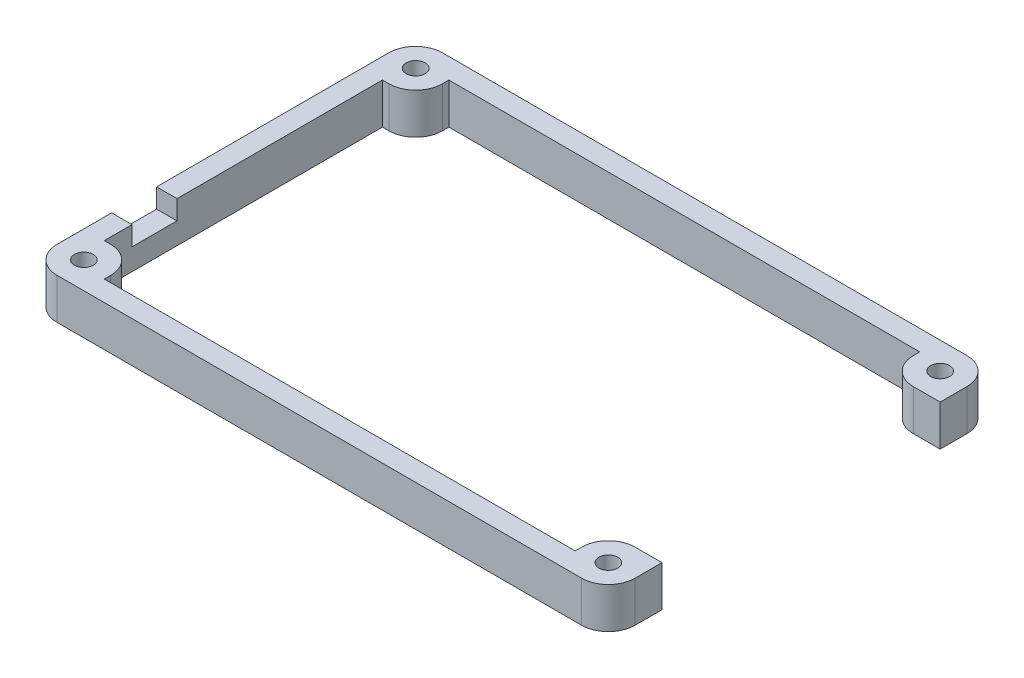
ISO-10303-21;
HEADER;
FILE_DESCRIPTION(('STEP AP214'),'2;1');
FILE_NAME('part.step','',(''),(''),'','','');
FILE_SCHEMA(('AUTOMOTIVE_DESIGN { 1 0 10303 214 1 1 1 1 }'));
ENDSEC;
DATA;
#1=APPLICATION_CONTEXT('core data for automotive mechanical design processes');
#2=APPLICATION_PROTOCOL_DEFINITION('international standard','automotive_design',2000,#1);
#3=PRODUCT_CONTEXT('',#1,'mechanical');
#4=PRODUCT('Part','Part','',(#3));
#5=PRODUCT_RELATED_PRODUCT_CATEGORY('part','',(#4));
#6=PRODUCT_DEFINITION_FORMATION('','',#4);
#7=PRODUCT_DEFINITION_CONTEXT('part definition',#1,'design');
#8=PRODUCT_DEFINITION('design','',#6,#7);
#9=PRODUCT_DEFINITION_SHAPE('','',#8);
#10=(LENGTH_UNIT() NAMED_UNIT(*) SI_UNIT(.MILLI.,.METRE.));
#11=(NAMED_UNIT(*) PLANE_ANGLE_UNIT() SI_UNIT($,.RADIAN.));
#12=(NAMED_UNIT(*) SI_UNIT($,.STERADIAN.) SOLID_ANGLE_UNIT());
#13=UNCERTAINTY_MEASURE_WITH_UNIT(LENGTH_MEASURE(1.E-05),#10,'distance_accuracy_value','');
#14=(GEOMETRIC_REPRESENTATION_CONTEXT(3) GLOBAL_UNCERTAINTY_ASSIGNED_CONTEXT((#13)) GLOBAL_UNIT_ASSIGNED_CONTEXT((#10,
#11,#12)) REPRESENTATION_CONTEXT('',''));
#15=CARTESIAN_POINT('',(0.,0.,0.));
#16=DIRECTION('',(0.,0.,1.));
#17=DIRECTION('',(1.,0.,0.));
#18=AXIS2_PLACEMENT_3D('',#15,#16,#17);
#19=CARTESIAN_POINT('',(-40.825,6.35,-25.825));
#20=DIRECTION('',(0.,1.,0.));
#21=DIRECTION('',(0.,0.,1.));
#22=AXIS2_PLACEMENT_3D('',#19,#20,#21);
#23=PLANE('',#22);
#24=DIRECTION('',(-1.,0.,0.));
#25=VECTOR('',#24,1.);
#26=CARTESIAN_POINT('',(40.825,6.35,-21.65));
#27=LINE('',#26,#25);
#28=CARTESIAN_POINT('',(45.,6.35,-21.65));
#29=VERTEX_POINT('',#28);
#30=CARTESIAN_POINT('',(40.825,6.35,-21.65));
#31=VERTEX_POINT('',#30);
#32=EDGE_CURVE('E375',#29,#31,#27,.T.);
#33=ORIENTED_EDGE('',*,*,#32,.F.);
#34=DIRECTION('',(0.,0.,-1.));
#35=VECTOR('',#34,1.);
#36=CARTESIAN_POINT('',(45.,6.35,-25.825));
#37=LINE('',#36,#35);
#38=CARTESIAN_POINT('',(45.,6.35,-25.825));
#39=VERTEX_POINT('',#38);
#40=EDGE_CURVE('E324',#29,#39,#37,.T.);
#41=ORIENTED_EDGE('',*,*,#40,.T.);
#42=CARTESIAN_POINT('',(40.825,6.35,-25.825));
#43=DIRECTION('',(0.,1.,0.));
#44=DIRECTION('',(0.,0.,1.));
#45=AXIS2_PLACEMENT_3D('',#42,#43,#44);
#46=CIRCLE('',#45,4.175);
#47=CARTESIAN_POINT('',(40.825,6.35,-30.));
#48=VERTEX_POINT('',#47);
#49=EDGE_CURVE('E330',#39,#48,#46,.T.);
#50=ORIENTED_EDGE('',*,*,#49,.T.);
#51=DIRECTION('',(-1.,0.,0.));
#52=VECTOR('',#51,1.);
#53=CARTESIAN_POINT('',(-40.825,6.35,-30.));
#54=LINE('',#53,#52);
#55=CARTESIAN_POINT('',(-40.825,6.35,-30.));
#56=VERTEX_POINT('',#55);
#57=EDGE_CURVE('E263',#48,#56,#54,.T.);
#58=ORIENTED_EDGE('',*,*,#57,.T.);
#59=CARTESIAN_POINT('',(-40.825,6.35,-25.825));
#60=DIRECTION('',(0.,1.,0.));
#61=DIRECTION('',(0.,0.,1.));
#62=AXIS2_PLACEMENT_3D('',#59,#60,#61);
#63=CIRCLE('',#62,4.17499999999999);
#64=CARTESIAN_POINT('',(-45.,6.35,-25.825));
#65=VERTEX_POINT('',#64);
#66=EDGE_CURVE('E258',#56,#65,#63,.T.);
#67=ORIENTED_EDGE('',*,*,#66,.T.);
#68=DIRECTION('',(0.,0.,1.));
#69=VECTOR('',#68,1.);
#70=CARTESIAN_POINT('',(-45.,6.35,-25.825));
#71=LINE('',#70,#69);
#72=CARTESIAN_POINT('',(-45.,6.35,10.325));
#73=VERTEX_POINT('',#72);
#74=EDGE_CURVE('E288',#65,#73,#71,.T.);
#75=ORIENTED_EDGE('',*,*,#74,.T.);
#76=DIRECTION('',(-1.,0.,0.));
#77=VECTOR('',#76,1.);
#78=CARTESIAN_POINT('',(-40.825,6.35,10.325));
#79=LINE('',#78,#77);
#80=CARTESIAN_POINT('',(-41.825,6.35,10.325));
#81=VERTEX_POINT('',#80);
#82=EDGE_CURVE('E343',#81,#73,#79,.T.);
#83=ORIENTED_EDGE('',*,*,#82,.F.);
#84=DIRECTION('',(0.,0.,1.));
#85=VECTOR('',#84,1.);
#86=CARTESIAN_POINT('',(-41.825,6.35,-21.65));
#87=LINE('',#86,#85);
#88=CARTESIAN_POINT('',(-41.825,6.35,-21.65));
#89=VERTEX_POINT('',#88);
#90=EDGE_CURVE('E346',#89,#81,#87,.T.);
#91=ORIENTED_EDGE('',*,*,#90,.F.);
#92=DIRECTION('',(-1.,0.,0.));
#93=VECTOR('',#92,1.);
#94=CARTESIAN_POINT('',(-40.825,6.35,-21.65));
#95=LINE('',#94,#93);
#96=CARTESIAN_POINT('',(-40.825,6.35,-21.65));
#97=VERTEX_POINT('',#96);
#98=EDGE_CURVE('E361',#97,#89,#95,.T.);
#99=ORIENTED_EDGE('',*,*,#98,.F.);
#100=CARTESIAN_POINT('',(-40.825,6.35,-25.825));
#101=DIRECTION('',(0.,-1.,0.));
#102=DIRECTION('',(0.,0.,1.));
#103=AXIS2_PLACEMENT_3D('',#100,#101,#102);
#104=CIRCLE('',#103,4.175);
#105=CARTESIAN_POINT('',(-36.65,6.35,-25.825));
#106=VERTEX_POINT('',#105);
#107=EDGE_CURVE('E505',#106,#97,#104,.T.);
#108=ORIENTED_EDGE('',*,*,#107,.F.);
#109=DIRECTION('',(0.,0.,1.));
#110=VECTOR('',#109,1.);
#111=CARTESIAN_POINT('',(-36.65,6.35,-25.825));
#112=LINE('',#111,#110);
#113=CARTESIAN_POINT('',(-36.65,6.35,-26.825));
#114=VERTEX_POINT('',#113);
#115=EDGE_CURVE('E504',#114,#106,#112,.T.);
#116=ORIENTED_EDGE('',*,*,#115,.F.);
#117=DIRECTION('',(-1.,0.,0.));
#118=VECTOR('',#117,1.);
#119=CARTESIAN_POINT('',(-36.65,6.35,-26.825));
#120=LINE('',#119,#118);
#121=CARTESIAN_POINT('',(36.65,6.35,-26.825));
#122=VERTEX_POINT('',#121);
#123=EDGE_CURVE('E502',#122,#114,#120,.T.);
#124=ORIENTED_EDGE('',*,*,#123,.F.);
#125=DIRECTION('',(0.,0.,-1.));
#126=VECTOR('',#125,1.);
#127=CARTESIAN_POINT('',(36.65,6.35,-25.825));
#128=LINE('',#127,#126);
#129=CARTESIAN_POINT('',(36.65,6.35,-25.825));
#130=VERTEX_POINT('',#129);
#131=EDGE_CURVE('E442',#130,#122,#128,.T.);
#132=ORIENTED_EDGE('',*,*,#131,.F.);
#133=CARTESIAN_POINT('',(40.825,6.35,-25.825));
#134=DIRECTION('',(0.,-1.,0.));
#135=DIRECTION('',(0.,0.,1.));
#136=AXIS2_PLACEMENT_3D('',#133,#134,#135);
#137=CIRCLE('',#136,4.175);
#138=EDGE_CURVE('E414',#31,#130,#137,.T.);
#139=ORIENTED_EDGE('',*,*,#138,.F.);
#140=EDGE_LOOP('',(#33,#41,#50,#58,#67,#75,#83,#91,#99,#108,#116,#124,#132,#139));
#141=FACE_BOUND('',#140,.T.);
#142=CARTESIAN_POINT('',(-40.825,6.35,-25.825));
#143=DIRECTION('',(0.,1.,0.));
#144=DIRECTION('',(0.,0.,1.));
#145=AXIS2_PLACEMENT_3D('',#142,#143,#144);
#146=CIRCLE('',#145,1.4732);
#147=CARTESIAN_POINT('',(-40.825,6.35,-24.3518));
#148=VERTEX_POINT('',#147);
#149=EDGE_CURVE('E480',#148,#148,#146,.T.);
#150=ORIENTED_EDGE('',*,*,#149,.F.);
#151=EDGE_LOOP('',(#150));
#152=FACE_BOUND('',#151,.T.);
#153=CARTESIAN_POINT('',(40.825,6.35,-25.825));
#154=DIRECTION('',(0.,1.,0.));
#155=DIRECTION('',(0.,0.,1.));
#156=AXIS2_PLACEMENT_3D('',#153,#154,#155);
#157=CIRCLE('',#156,1.4732);
#158=CARTESIAN_POINT('',(40.825,6.35,-24.3518));
#159=VERTEX_POINT('',#158);
#160=EDGE_CURVE('E460',#159,#159,#157,.T.);
#161=ORIENTED_EDGE('',*,*,#160,.F.);
#162=EDGE_LOOP('',(#161));
#163=FACE_BOUND('',#162,.T.);
#164=ADVANCED_FACE('F33',(#141,#152,#163),#23,.T.);
#165=CARTESIAN_POINT('',(45.,6.35,-25.825));
#166=DIRECTION('',(-1.,0.,0.));
#167=DIRECTION('',(0.,0.,1.));
#168=AXIS2_PLACEMENT_3D('',#165,#166,#167);
#169=PLANE('',#168);
#170=ORIENTED_EDGE('',*,*,#40,.F.);
#171=DIRECTION('',(0.,1.,0.));
#172=VECTOR('',#171,1.);
#173=CARTESIAN_POINT('',(45.,0.,-21.65));
#174=LINE('',#173,#172);
#175=CARTESIAN_POINT('',(45.,0.,-21.65));
#176=VERTEX_POINT('',#175);
#177=EDGE_CURVE('E242',#176,#29,#174,.T.);
#178=ORIENTED_EDGE('',*,*,#177,.F.);
#179=DIRECTION('',(0.,0.,-1.));
#180=VECTOR('',#179,1.);
#181=CARTESIAN_POINT('',(45.,0.,-25.825));
#182=LINE('',#181,#180);
#183=CARTESIAN_POINT('',(45.,0.,-25.825));
#184=VERTEX_POINT('',#183);
#185=EDGE_CURVE('E249',#176,#184,#182,.T.);
#186=ORIENTED_EDGE('',*,*,#185,.T.);
#187=DIRECTION('',(0.,-1.,0.));
#188=VECTOR('',#187,1.);
#189=CARTESIAN_POINT('',(45.,6.35,-25.825));
#190=LINE('',#189,#188);
#191=EDGE_CURVE('E266',#39,#184,#190,.T.);
#192=ORIENTED_EDGE('',*,*,#191,.F.);
#193=EDGE_LOOP('',(#170,#178,#186,#192));
#194=FACE_BOUND('',#193,.T.);
#195=ADVANCED_FACE('F455',(#194),#169,.F.);
#196=CARTESIAN_POINT('',(45.,6.35,25.825));
#197=VERTEX_POINT('',#196);
#198=CARTESIAN_POINT('',(45.,6.35,21.65));
#199=VERTEX_POINT('',#198);
#200=EDGE_CURVE('E329',#197,#199,#37,.T.);
#201=ORIENTED_EDGE('',*,*,#200,.T.);
#202=DIRECTION('',(1.,0.,0.));
#203=VECTOR('',#202,1.);
#204=CARTESIAN_POINT('',(40.825,6.35,21.65));
#205=LINE('',#204,#203);
#206=CARTESIAN_POINT('',(40.825,6.35,21.65));
#207=VERTEX_POINT('',#206);
#208=EDGE_CURVE('E238',#207,#199,#205,.T.);
#209=ORIENTED_EDGE('',*,*,#208,.F.);
#210=CARTESIAN_POINT('',(40.825,6.35,25.825));
#211=DIRECTION('',(0.,-1.,0.));
#212=DIRECTION('',(0.,0.,1.));
#213=AXIS2_PLACEMENT_3D('',#210,#211,#212);
#214=CIRCLE('',#213,4.175);
#215=CARTESIAN_POINT('',(36.65,6.35,25.825));
#216=VERTEX_POINT('',#215);
#217=EDGE_CURVE('E372',#216,#207,#214,.T.);
#218=ORIENTED_EDGE('',*,*,#217,.F.);
#219=DIRECTION('',(0.,0.,-1.));
#220=VECTOR('',#219,1.);
#221=CARTESIAN_POINT('',(36.65,6.35,25.825));
#222=LINE('',#221,#220);
#223=CARTESIAN_POINT('',(36.65,6.35,26.825));
#224=VERTEX_POINT('',#223);
#225=EDGE_CURVE('E370',#224,#216,#222,.T.);
#226=ORIENTED_EDGE('',*,*,#225,.F.);
#227=DIRECTION('',(1.,0.,0.));
#228=VECTOR('',#227,1.);
#229=CARTESIAN_POINT('',(-36.65,6.35,26.825));
#230=LINE('',#229,#228);
#231=CARTESIAN_POINT('',(-36.65,6.35,26.825));
#232=VERTEX_POINT('',#231);
#233=EDGE_CURVE('E368',#232,#224,#230,.T.);
#234=ORIENTED_EDGE('',*,*,#233,.F.);
#235=DIRECTION('',(0.,0.,1.));
#236=VECTOR('',#235,1.);
#237=CARTESIAN_POINT('',(-36.65,6.35,25.825));
#238=LINE('',#237,#236);
#239=CARTESIAN_POINT('',(-36.65,6.35,25.825));
#240=VERTEX_POINT('',#239);
#241=EDGE_CURVE('E366',#240,#232,#238,.T.);
#242=ORIENTED_EDGE('',*,*,#241,.F.);
#243=CARTESIAN_POINT('',(-40.825,6.35,25.825));
#244=DIRECTION('',(0.,-1.,0.));
#245=DIRECTION('',(0.,0.,1.));
#246=AXIS2_PLACEMENT_3D('',#243,#244,#245);
#247=CIRCLE('',#246,4.17499999999999);
#248=CARTESIAN_POINT('',(-40.825,6.35,21.65));
#249=VERTEX_POINT('',#248);
#250=EDGE_CURVE('E359',#249,#240,#247,.T.);
#251=ORIENTED_EDGE('',*,*,#250,.F.);
#252=DIRECTION('',(1.,0.,0.));
#253=VECTOR('',#252,1.);
#254=CARTESIAN_POINT('',(-40.825,6.35,21.65));
#255=LINE('',#254,#253);
#256=CARTESIAN_POINT('',(-41.825,6.35,21.65));
#257=VERTEX_POINT('',#256);
#258=EDGE_CURVE('E356',#257,#249,#255,.T.);
#259=ORIENTED_EDGE('',*,*,#258,.F.);
#260=CARTESIAN_POINT('',(-41.825,6.35,17.325));
#261=VERTEX_POINT('',#260);
#262=EDGE_CURVE('E357',#261,#257,#87,.T.);
#263=ORIENTED_EDGE('',*,*,#262,.F.);
#264=DIRECTION('',(1.,0.,0.));
#265=VECTOR('',#264,1.);
#266=CARTESIAN_POINT('',(-40.825,6.35,17.325));
#267=LINE('',#266,#265);
#268=CARTESIAN_POINT('',(-45.,6.35,17.325));
#269=VERTEX_POINT('',#268);
#270=EDGE_CURVE('E48',#269,#261,#267,.T.);
#271=ORIENTED_EDGE('',*,*,#270,.F.);
#272=CARTESIAN_POINT('',(-45.,6.35,25.825));
#273=VERTEX_POINT('',#272);
#274=EDGE_CURVE('E338',#269,#273,#71,.T.);
#275=ORIENTED_EDGE('',*,*,#274,.T.);
#276=CARTESIAN_POINT('',(-40.825,6.35,25.825));
#277=DIRECTION('',(0.,1.,0.));
#278=DIRECTION('',(0.,0.,1.));
#279=AXIS2_PLACEMENT_3D('',#276,#277,#278);
#280=CIRCLE('',#279,4.17500000000001);
#281=CARTESIAN_POINT('',(-40.825,6.35,30.));
#282=VERTEX_POINT('',#281);
#283=EDGE_CURVE('E322',#273,#282,#280,.T.);
#284=ORIENTED_EDGE('',*,*,#283,.T.);
#285=DIRECTION('',(1.,0.,0.));
#286=VECTOR('',#285,1.);
#287=CARTESIAN_POINT('',(-40.825,6.35,30.));
#288=LINE('',#287,#286);
#289=CARTESIAN_POINT('',(40.825,6.35,30.));
#290=VERTEX_POINT('',#289);
#291=EDGE_CURVE('E319',#282,#290,#288,.T.);
#292=ORIENTED_EDGE('',*,*,#291,.T.);
#293=CARTESIAN_POINT('',(40.825,6.35,25.825));
#294=DIRECTION('',(0.,1.,0.));
#295=DIRECTION('',(0.,0.,1.));
#296=AXIS2_PLACEMENT_3D('',#293,#294,#295);
#297=CIRCLE('',#296,4.17499999999999);
#298=EDGE_CURVE('E321',#290,#197,#297,.T.);
#299=ORIENTED_EDGE('',*,*,#298,.T.);
#300=EDGE_LOOP('',(#201,#209,#218,#226,#234,#242,#251,#259,#263,#271,#275,#284,#292,#299));
#301=FACE_BOUND('',#300,.T.);
#302=CARTESIAN_POINT('',(40.825,6.35,25.825));
#303=DIRECTION('',(0.,1.,0.));
#304=DIRECTION('',(0.,0.,1.));
#305=AXIS2_PLACEMENT_3D('',#302,#303,#304);
#306=CIRCLE('',#305,1.4732);
#307=CARTESIAN_POINT('',(40.825,6.35,27.2982));
#308=VERTEX_POINT('',#307);
#309=EDGE_CURVE('E468',#308,#308,#306,.T.);
#310=ORIENTED_EDGE('',*,*,#309,.F.);
#311=EDGE_LOOP('',(#310));
#312=FACE_BOUND('',#311,.T.);
#313=CARTESIAN_POINT('',(-40.825,6.35,25.825));
#314=DIRECTION('',(0.,1.,0.));
#315=DIRECTION('',(0.,0.,1.));
#316=AXIS2_PLACEMENT_3D('',#313,#314,#315);
#317=CIRCLE('',#316,1.4732);
#318=CARTESIAN_POINT('',(-40.825,6.35,27.2982));
#319=VERTEX_POINT('',#318);
#320=EDGE_CURVE('E474',#319,#319,#317,.T.);
#321=ORIENTED_EDGE('',*,*,#320,.F.);
#322=EDGE_LOOP('',(#321));
#323=FACE_BOUND('',#322,.T.);
#324=ADVANCED_FACE('F548',(#301,#312,#323),#23,.T.);
#325=CARTESIAN_POINT('',(-40.825,0.,-25.825));
#326=DIRECTION('',(0.,1.,0.));
#327=DIRECTION('',(0.,0.,1.));
#328=AXIS2_PLACEMENT_3D('',#325,#326,#327);
#329=PLANE('',#328);
#330=CARTESIAN_POINT('',(40.825,0.,-25.825));
#331=DIRECTION('',(0.,-1.,0.));
#332=DIRECTION('',(0.,0.,-1.));
#333=AXIS2_PLACEMENT_3D('',#330,#331,#332);
#334=CIRCLE('',#333,1.4732);
#335=CARTESIAN_POINT('',(40.825,0.,-27.2982));
#336=VERTEX_POINT('',#335);
#337=EDGE_CURVE('E457',#336,#336,#334,.T.);
#338=ORIENTED_EDGE('',*,*,#337,.F.);
#339=EDGE_LOOP('',(#338));
#340=FACE_BOUND('',#339,.T.);
#341=CARTESIAN_POINT('',(40.825,0.,25.825));
#342=DIRECTION('',(0.,-1.,0.));
#343=DIRECTION('',(0.,0.,-1.));
#344=AXIS2_PLACEMENT_3D('',#341,#342,#343);
#345=CIRCLE('',#344,1.4732);
#346=CARTESIAN_POINT('',(40.825,0.,24.3518));
#347=VERTEX_POINT('',#346);
#348=EDGE_CURVE('E465',#347,#347,#345,.T.);
#349=ORIENTED_EDGE('',*,*,#348,.F.);
#350=EDGE_LOOP('',(#349));
#351=FACE_BOUND('',#350,.T.);
#352=CARTESIAN_POINT('',(-40.825,0.,25.825));
#353=DIRECTION('',(0.,-1.,0.));
#354=DIRECTION('',(0.,0.,-1.));
#355=AXIS2_PLACEMENT_3D('',#352,#353,#354);
#356=CIRCLE('',#355,1.4732);
#357=CARTESIAN_POINT('',(-40.825,0.,24.3518));
#358=VERTEX_POINT('',#357);
#359=EDGE_CURVE('E471',#358,#358,#356,.T.);
#360=ORIENTED_EDGE('',*,*,#359,.F.);
#361=EDGE_LOOP('',(#360));
#362=FACE_BOUND('',#361,.T.);
#363=CARTESIAN_POINT('',(-40.825,0.,-25.825));
#364=DIRECTION('',(0.,-1.,0.));
#365=DIRECTION('',(0.,0.,-1.));
#366=AXIS2_PLACEMENT_3D('',#363,#364,#365);
#367=CIRCLE('',#366,1.4732);
#368=CARTESIAN_POINT('',(-40.825,0.,-27.2982));
#369=VERTEX_POINT('',#368);
#370=EDGE_CURVE('E477',#369,#369,#367,.T.);
#371=ORIENTED_EDGE('',*,*,#370,.F.);
#372=EDGE_LOOP('',(#371));
#373=FACE_BOUND('',#372,.T.);
#374=ORIENTED_EDGE('',*,*,#185,.F.);
#375=DIRECTION('',(-1.,0.,0.));
#376=VECTOR('',#375,1.);
#377=CARTESIAN_POINT('',(40.825,0.,-21.65));
#378=LINE('',#377,#376);
#379=CARTESIAN_POINT('',(40.825,0.,-21.65));
#380=VERTEX_POINT('',#379);
#381=EDGE_CURVE('E232',#176,#380,#378,.T.);
#382=ORIENTED_EDGE('',*,*,#381,.T.);
#383=CARTESIAN_POINT('',(40.825,0.,-25.825));
#384=DIRECTION('',(0.,-1.,0.));
#385=DIRECTION('',(0.,0.,1.));
#386=AXIS2_PLACEMENT_3D('',#383,#384,#385);
#387=CIRCLE('',#386,4.175);
#388=CARTESIAN_POINT('',(36.65,0.,-25.825));
#389=VERTEX_POINT('',#388);
#390=EDGE_CURVE('E56',#380,#389,#387,.T.);
#391=ORIENTED_EDGE('',*,*,#390,.T.);
#392=DIRECTION('',(0.,0.,-1.));
#393=VECTOR('',#392,1.);
#394=CARTESIAN_POINT('',(36.65,0.,-25.825));
#395=LINE('',#394,#393);
#396=CARTESIAN_POINT('',(36.65,0.,-26.825));
#397=VERTEX_POINT('',#396);
#398=EDGE_CURVE('E379',#389,#397,#395,.T.);
#399=ORIENTED_EDGE('',*,*,#398,.T.);
#400=DIRECTION('',(-1.,0.,0.));
#401=VECTOR('',#400,1.);
#402=CARTESIAN_POINT('',(-36.65,0.,-26.825));
#403=LINE('',#402,#401);
#404=CARTESIAN_POINT('',(-36.65,0.,-26.825));
#405=VERTEX_POINT('',#404);
#406=EDGE_CURVE('E382',#397,#405,#403,.T.);
#407=ORIENTED_EDGE('',*,*,#406,.T.);
#408=DIRECTION('',(0.,0.,1.));
#409=VECTOR('',#408,1.);
#410=CARTESIAN_POINT('',(-36.65,0.,-25.825));
#411=LINE('',#410,#409);
#412=CARTESIAN_POINT('',(-36.65,0.,-25.825));
#413=VERTEX_POINT('',#412);
#414=EDGE_CURVE('E385',#405,#413,#411,.T.);
#415=ORIENTED_EDGE('',*,*,#414,.T.);
#416=CARTESIAN_POINT('',(-40.825,0.,-25.825));
#417=DIRECTION('',(0.,-1.,0.));
#418=DIRECTION('',(0.,0.,1.));
#419=AXIS2_PLACEMENT_3D('',#416,#417,#418);
#420=CIRCLE('',#419,4.175);
#421=CARTESIAN_POINT('',(-40.825,0.,-21.65));
#422=VERTEX_POINT('',#421);
#423=EDGE_CURVE('E388',#413,#422,#420,.T.);
#424=ORIENTED_EDGE('',*,*,#423,.T.);
#425=DIRECTION('',(-1.,0.,0.));
#426=VECTOR('',#425,1.);
#427=CARTESIAN_POINT('',(-40.825,0.,-21.65));
#428=LINE('',#427,#426);
#429=CARTESIAN_POINT('',(-41.825,0.,-21.65));
#430=VERTEX_POINT('',#429);
#431=EDGE_CURVE('E391',#422,#430,#428,.T.);
#432=ORIENTED_EDGE('',*,*,#431,.T.);
#433=DIRECTION('',(0.,0.,1.));
#434=VECTOR('',#433,1.);
#435=CARTESIAN_POINT('',(-41.825,0.,-21.65));
#436=LINE('',#435,#434);
#437=CARTESIAN_POINT('',(-41.825,0.,21.65));
#438=VERTEX_POINT('',#437);
#439=EDGE_CURVE('E394',#430,#438,#436,.T.);
#440=ORIENTED_EDGE('',*,*,#439,.T.);
#441=DIRECTION('',(1.,0.,0.));
#442=VECTOR('',#441,1.);
#443=CARTESIAN_POINT('',(-40.825,0.,21.65));
#444=LINE('',#443,#442);
#445=CARTESIAN_POINT('',(-40.825,0.,21.65));
#446=VERTEX_POINT('',#445);
#447=EDGE_CURVE('E397',#438,#446,#444,.T.);
#448=ORIENTED_EDGE('',*,*,#447,.T.);
#449=CARTESIAN_POINT('',(-40.825,0.,25.825));
#450=DIRECTION('',(0.,-1.,0.));
#451=DIRECTION('',(0.,0.,1.));
#452=AXIS2_PLACEMENT_3D('',#449,#450,#451);
#453=CIRCLE('',#452,4.17499999999999);
#454=CARTESIAN_POINT('',(-36.65,0.,25.825));
#455=VERTEX_POINT('',#454);
#456=EDGE_CURVE('E400',#446,#455,#453,.T.);
#457=ORIENTED_EDGE('',*,*,#456,.T.);
#458=DIRECTION('',(0.,0.,1.));
#459=VECTOR('',#458,1.);
#460=CARTESIAN_POINT('',(-36.65,0.,25.825));
#461=LINE('',#460,#459);
#462=CARTESIAN_POINT('',(-36.65,0.,26.825));
#463=VERTEX_POINT('',#462);
#464=EDGE_CURVE('E403',#455,#463,#461,.T.);
#465=ORIENTED_EDGE('',*,*,#464,.T.);
#466=DIRECTION('',(1.,0.,0.));
#467=VECTOR('',#466,1.);
#468=CARTESIAN_POINT('',(-36.65,0.,26.825));
#469=LINE('',#468,#467);
#470=CARTESIAN_POINT('',(36.65,0.,26.825));
#471=VERTEX_POINT('',#470);
#472=EDGE_CURVE('E406',#463,#471,#469,.T.);
#473=ORIENTED_EDGE('',*,*,#472,.T.);
#474=DIRECTION('',(0.,0.,-1.));
#475=VECTOR('',#474,1.);
#476=CARTESIAN_POINT('',(36.65,0.,25.825));
#477=LINE('',#476,#475);
#478=CARTESIAN_POINT('',(36.65,0.,25.825));
#479=VERTEX_POINT('',#478);
#480=EDGE_CURVE('E409',#471,#479,#477,.T.);
#481=ORIENTED_EDGE('',*,*,#480,.T.);
#482=CARTESIAN_POINT('',(40.825,0.,25.825));
#483=DIRECTION('',(0.,-1.,0.));
#484=DIRECTION('',(0.,0.,1.));
#485=AXIS2_PLACEMENT_3D('',#482,#483,#484);
#486=CIRCLE('',#485,4.175);
#487=CARTESIAN_POINT('',(40.825,0.,21.65));
#488=VERTEX_POINT('',#487);
#489=EDGE_CURVE('E229',#479,#488,#486,.T.);
#490=ORIENTED_EDGE('',*,*,#489,.T.);
#491=DIRECTION('',(1.,0.,0.));
#492=VECTOR('',#491,1.);
#493=CARTESIAN_POINT('',(40.825,0.,21.65));
#494=LINE('',#493,#492);
#495=CARTESIAN_POINT('',(45.,0.,21.65));
#496=VERTEX_POINT('',#495);
#497=EDGE_CURVE('E220',#488,#496,#494,.T.);
#498=ORIENTED_EDGE('',*,*,#497,.T.);
#499=CARTESIAN_POINT('',(45.,0.,25.825));
#500=VERTEX_POINT('',#499);
#501=EDGE_CURVE('E226',#500,#496,#182,.T.);
#502=ORIENTED_EDGE('',*,*,#501,.F.);
#503=CARTESIAN_POINT('',(40.825,0.,25.825));
#504=DIRECTION('',(0.,1.,0.));
#505=DIRECTION('',(0.,0.,1.));
#506=AXIS2_PLACEMENT_3D('',#503,#504,#505);
#507=CIRCLE('',#506,4.17499999999999);
#508=CARTESIAN_POINT('',(40.825,0.,30.));
#509=VERTEX_POINT('',#508);
#510=EDGE_CURVE('E253',#509,#500,#507,.T.);
#511=ORIENTED_EDGE('',*,*,#510,.F.);
#512=DIRECTION('',(1.,0.,0.));
#513=VECTOR('',#512,1.);
#514=CARTESIAN_POINT('',(-40.825,0.,30.));
#515=LINE('',#514,#513);
#516=CARTESIAN_POINT('',(-40.825,0.,30.));
#517=VERTEX_POINT('',#516);
#518=EDGE_CURVE('E305',#517,#509,#515,.T.);
#519=ORIENTED_EDGE('',*,*,#518,.F.);
#520=CARTESIAN_POINT('',(-40.825,0.,25.825));
#521=DIRECTION('',(0.,1.,0.));
#522=DIRECTION('',(0.,0.,1.));
#523=AXIS2_PLACEMENT_3D('',#520,#521,#522);
#524=CIRCLE('',#523,4.17500000000001);
#525=CARTESIAN_POINT('',(-45.,0.,25.825));
#526=VERTEX_POINT('',#525);
#527=EDGE_CURVE('E298',#526,#517,#524,.T.);
#528=ORIENTED_EDGE('',*,*,#527,.F.);
#529=DIRECTION('',(0.,0.,1.));
#530=VECTOR('',#529,1.);
#531=CARTESIAN_POINT('',(-45.,0.,-25.825));
#532=LINE('',#531,#530);
#533=CARTESIAN_POINT('',(-45.,0.,-25.825));
#534=VERTEX_POINT('',#533);
#535=EDGE_CURVE('E285',#534,#526,#532,.T.);
#536=ORIENTED_EDGE('',*,*,#535,.F.);
#537=CARTESIAN_POINT('',(-40.825,0.,-25.825));
#538=DIRECTION('',(0.,1.,0.));
#539=DIRECTION('',(0.,0.,1.));
#540=AXIS2_PLACEMENT_3D('',#537,#538,#539);
#541=CIRCLE('',#540,4.17499999999999);
#542=CARTESIAN_POINT('',(-40.825,0.,-30.));
#543=VERTEX_POINT('',#542);
#544=EDGE_CURVE('E293',#543,#534,#541,.T.);
#545=ORIENTED_EDGE('',*,*,#544,.F.);
#546=DIRECTION('',(-1.,0.,0.));
#547=VECTOR('',#546,1.);
#548=CARTESIAN_POINT('',(-40.825,0.,-30.));
#549=LINE('',#548,#547);
#550=CARTESIAN_POINT('',(40.825,0.,-30.));
#551=VERTEX_POINT('',#550);
#552=EDGE_CURVE('E251',#551,#543,#549,.T.);
#553=ORIENTED_EDGE('',*,*,#552,.F.);
#554=CARTESIAN_POINT('',(40.825,0.,-25.825));
#555=DIRECTION('',(0.,1.,0.));
#556=DIRECTION('',(0.,0.,1.));
#557=AXIS2_PLACEMENT_3D('',#554,#555,#556);
#558=CIRCLE('',#557,4.175);
#559=EDGE_CURVE('E248',#184,#551,#558,.T.);
#560=ORIENTED_EDGE('',*,*,#559,.F.);
#561=EDGE_LOOP('',(#374,#382,#391,#399,#407,#415,#424,#432,#440,#448,#457,#465,#473,#481,#490,
#498,#502,#511,#519,#528,#536,#545,#553,#560));
#562=FACE_BOUND('',#561,.T.);
#563=ADVANCED_FACE('F223',(#340,#351,#362,#373,#562),#329,.F.);
#564=CARTESIAN_POINT('',(-40.825,6.35,-25.825));
#565=DIRECTION('',(0.,-1.,0.));
#566=DIRECTION('',(0.,0.,-1.));
#567=AXIS2_PLACEMENT_3D('',#564,#565,#566);
#568=CYLINDRICAL_SURFACE('',#567,4.17499999999999);
#569=ORIENTED_EDGE('',*,*,#544,.T.);
#570=DIRECTION('',(0.,-1.,0.));
#571=VECTOR('',#570,1.);
#572=CARTESIAN_POINT('',(-45.,6.35,-25.825));
#573=LINE('',#572,#571);
#574=EDGE_CURVE('E41',#65,#534,#573,.T.);
#575=ORIENTED_EDGE('',*,*,#574,.F.);
#576=ORIENTED_EDGE('',*,*,#66,.F.);
#577=DIRECTION('',(0.,-1.,0.));
#578=VECTOR('',#577,1.);
#579=CARTESIAN_POINT('',(-40.825,6.35,-30.));
#580=LINE('',#579,#578);
#581=EDGE_CURVE('E259',#56,#543,#580,.T.);
#582=ORIENTED_EDGE('',*,*,#581,.T.);
#583=EDGE_LOOP('',(#569,#575,#576,#582));
#584=FACE_BOUND('',#583,.T.);
#585=ADVANCED_FACE('F35',(#584),#568,.T.);
#586=CARTESIAN_POINT('',(-45.,6.35,-25.825));
#587=DIRECTION('',(1.,0.,0.));
#588=DIRECTION('',(0.,0.,-1.));
#589=AXIS2_PLACEMENT_3D('',#586,#587,#588);
#590=PLANE('',#589);
#591=DIRECTION('',(0.,0.,1.));
#592=VECTOR('',#591,1.);
#593=CARTESIAN_POINT('',(-45.,3.35,10.325));
#594=LINE('',#593,#592);
#595=CARTESIAN_POINT('',(-45.,3.35,10.325));
#596=VERTEX_POINT('',#595);
#597=CARTESIAN_POINT('',(-45.,3.35,17.325));
#598=VERTEX_POINT('',#597);
#599=EDGE_CURVE('E484',#596,#598,#594,.T.);
#600=ORIENTED_EDGE('',*,*,#599,.F.);
#601=DIRECTION('',(0.,-1.,0.));
#602=VECTOR('',#601,1.);
#603=CARTESIAN_POINT('',(-45.,9.35,10.325));
#604=LINE('',#603,#602);
#605=EDGE_CURVE('E488',#73,#596,#604,.T.);
#606=ORIENTED_EDGE('',*,*,#605,.F.);
#607=ORIENTED_EDGE('',*,*,#74,.F.);
#608=ORIENTED_EDGE('',*,*,#574,.T.);
#609=ORIENTED_EDGE('',*,*,#535,.T.);
#610=DIRECTION('',(0.,-1.,0.));
#611=VECTOR('',#610,1.);
#612=CARTESIAN_POINT('',(-45.,6.35,25.825));
#613=LINE('',#612,#611);
#614=EDGE_CURVE('E276',#273,#526,#613,.T.);
#615=ORIENTED_EDGE('',*,*,#614,.F.);
#616=ORIENTED_EDGE('',*,*,#274,.F.);
#617=DIRECTION('',(0.,1.,0.));
#618=VECTOR('',#617,1.);
#619=CARTESIAN_POINT('',(-45.,9.35,17.325));
#620=LINE('',#619,#618);
#621=EDGE_CURVE('E483',#598,#269,#620,.T.);
#622=ORIENTED_EDGE('',*,*,#621,.F.);
#623=EDGE_LOOP('',(#600,#606,#607,#608,#609,#615,#616,#622));
#624=FACE_BOUND('',#623,.T.);
#625=ADVANCED_FACE('F283',(#624),#590,.F.);
#626=CARTESIAN_POINT('',(-40.825,6.35,25.825));
#627=DIRECTION('',(0.,-1.,0.));
#628=DIRECTION('',(0.,0.,-1.));
#629=AXIS2_PLACEMENT_3D('',#626,#627,#628);
#630=CYLINDRICAL_SURFACE('',#629,4.17500000000001);
#631=ORIENTED_EDGE('',*,*,#527,.T.);
#632=DIRECTION('',(0.,-1.,0.));
#633=VECTOR('',#632,1.);
#634=CARTESIAN_POINT('',(-40.825,6.35,30.));
#635=LINE('',#634,#633);
#636=EDGE_CURVE('E273',#282,#517,#635,.T.);
#637=ORIENTED_EDGE('',*,*,#636,.F.);
#638=ORIENTED_EDGE('',*,*,#283,.F.);
#639=ORIENTED_EDGE('',*,*,#614,.T.);
#640=EDGE_LOOP('',(#631,#637,#638,#639));
#641=FACE_BOUND('',#640,.T.);
#642=ADVANCED_FACE('F315',(#641),#630,.T.);
#643=CARTESIAN_POINT('',(-40.825,6.35,30.));
#644=DIRECTION('',(0.,0.,-1.));
#645=DIRECTION('',(-1.,0.,0.));
#646=AXIS2_PLACEMENT_3D('',#643,#644,#645);
#647=PLANE('',#646);
#648=ORIENTED_EDGE('',*,*,#518,.T.);
#649=DIRECTION('',(0.,-1.,0.));
#650=VECTOR('',#649,1.);
#651=CARTESIAN_POINT('',(40.825,6.35,30.));
#652=LINE('',#651,#650);
#653=EDGE_CURVE('E270',#290,#509,#652,.T.);
#654=ORIENTED_EDGE('',*,*,#653,.F.);
#655=ORIENTED_EDGE('',*,*,#291,.F.);
#656=ORIENTED_EDGE('',*,*,#636,.T.);
#657=EDGE_LOOP('',(#648,#654,#655,#656));
#658=FACE_BOUND('',#657,.T.);
#659=ADVANCED_FACE('F318',(#658),#647,.F.);
#660=CARTESIAN_POINT('',(40.825,6.35,25.825));
#661=DIRECTION('',(0.,-1.,0.));
#662=DIRECTION('',(0.,0.,-1.));
#663=AXIS2_PLACEMENT_3D('',#660,#661,#662);
#664=CYLINDRICAL_SURFACE('',#663,4.17499999999999);
#665=ORIENTED_EDGE('',*,*,#510,.T.);
#666=DIRECTION('',(0.,-1.,0.));
#667=VECTOR('',#666,1.);
#668=CARTESIAN_POINT('',(45.,6.35,25.825));
#669=LINE('',#668,#667);
#670=EDGE_CURVE('E247',#197,#500,#669,.T.);
#671=ORIENTED_EDGE('',*,*,#670,.F.);
#672=ORIENTED_EDGE('',*,*,#298,.F.);
#673=ORIENTED_EDGE('',*,*,#653,.T.);
#674=EDGE_LOOP('',(#665,#671,#672,#673));
#675=FACE_BOUND('',#674,.T.);
#676=ADVANCED_FACE('F310',(#675),#664,.T.);
#677=ORIENTED_EDGE('',*,*,#501,.T.);
#678=DIRECTION('',(0.,1.,0.));
#679=VECTOR('',#678,1.);
#680=CARTESIAN_POINT('',(45.,0.,21.65));
#681=LINE('',#680,#679);
#682=EDGE_CURVE('E235',#496,#199,#681,.T.);
#683=ORIENTED_EDGE('',*,*,#682,.T.);
#684=ORIENTED_EDGE('',*,*,#200,.F.);
#685=ORIENTED_EDGE('',*,*,#670,.T.);
#686=EDGE_LOOP('',(#677,#683,#684,#685));
#687=FACE_BOUND('',#686,.T.);
#688=ADVANCED_FACE('F245',(#687),#169,.F.);
#689=CARTESIAN_POINT('',(40.825,6.35,-25.825));
#690=DIRECTION('',(0.,-1.,0.));
#691=DIRECTION('',(0.,0.,-1.));
#692=AXIS2_PLACEMENT_3D('',#689,#690,#691);
#693=CYLINDRICAL_SURFACE('',#692,4.175);
#694=ORIENTED_EDGE('',*,*,#559,.T.);
#695=DIRECTION('',(0.,-1.,0.));
#696=VECTOR('',#695,1.);
#697=CARTESIAN_POINT('',(40.825,6.35,-30.));
#698=LINE('',#697,#696);
#699=EDGE_CURVE('E262',#48,#551,#698,.T.);
#700=ORIENTED_EDGE('',*,*,#699,.F.);
#701=ORIENTED_EDGE('',*,*,#49,.F.);
#702=ORIENTED_EDGE('',*,*,#191,.T.);
#703=EDGE_LOOP('',(#694,#700,#701,#702));
#704=FACE_BOUND('',#703,.T.);
#705=ADVANCED_FACE('F588',(#704),#693,.T.);
#706=CARTESIAN_POINT('',(-40.825,6.35,-30.));
#707=DIRECTION('',(0.,0.,1.));
#708=DIRECTION('',(1.,0.,0.));
#709=AXIS2_PLACEMENT_3D('',#706,#707,#708);
#710=PLANE('',#709);
#711=ORIENTED_EDGE('',*,*,#552,.T.);
#712=ORIENTED_EDGE('',*,*,#581,.F.);
#713=ORIENTED_EDGE('',*,*,#57,.F.);
#714=ORIENTED_EDGE('',*,*,#699,.T.);
#715=EDGE_LOOP('',(#711,#712,#713,#714));
#716=FACE_BOUND('',#715,.T.);
#717=ADVANCED_FACE('F337',(#716),#710,.F.);
#718=CARTESIAN_POINT('',(40.825,6.35,-25.825));
#719=DIRECTION('',(0.,-1.,0.));
#720=DIRECTION('',(0.,0.,-1.));
#721=AXIS2_PLACEMENT_3D('',#718,#719,#720);
#722=CYLINDRICAL_SURFACE('',#721,4.175);
#723=ORIENTED_EDGE('',*,*,#390,.F.);
#724=DIRECTION('',(0.,-1.,0.));
#725=VECTOR('',#724,1.);
#726=CARTESIAN_POINT('',(40.825,6.35,-21.65));
#727=LINE('',#726,#725);
#728=EDGE_CURVE('E377',#31,#380,#727,.T.);
#729=ORIENTED_EDGE('',*,*,#728,.F.);
#730=ORIENTED_EDGE('',*,*,#138,.T.);
#731=DIRECTION('',(0.,-1.,0.));
#732=VECTOR('',#731,1.);
#733=CARTESIAN_POINT('',(36.65,6.35,-25.825));
#734=LINE('',#733,#732);
#735=EDGE_CURVE('E296',#130,#389,#734,.T.);
#736=ORIENTED_EDGE('',*,*,#735,.T.);
#737=EDGE_LOOP('',(#723,#729,#730,#736));
#738=FACE_BOUND('',#737,.T.);
#739=ADVANCED_FACE('F587',(#738),#722,.T.);
#740=CARTESIAN_POINT('',(36.65,6.35,-25.825));
#741=DIRECTION('',(-1.,0.,0.));
#742=DIRECTION('',(0.,0.,1.));
#743=AXIS2_PLACEMENT_3D('',#740,#741,#742);
#744=PLANE('',#743);
#745=ORIENTED_EDGE('',*,*,#398,.F.);
#746=ORIENTED_EDGE('',*,*,#735,.F.);
#747=ORIENTED_EDGE('',*,*,#131,.T.);
#748=DIRECTION('',(0.,-1.,0.));
#749=VECTOR('',#748,1.);
#750=CARTESIAN_POINT('',(36.65,6.35,-26.825));
#751=LINE('',#750,#749);
#752=EDGE_CURVE('E300',#122,#397,#751,.T.);
#753=ORIENTED_EDGE('',*,*,#752,.T.);
#754=EDGE_LOOP('',(#745,#746,#747,#753));
#755=FACE_BOUND('',#754,.T.);
#756=ADVANCED_FACE('F439',(#755),#744,.T.);
#757=CARTESIAN_POINT('',(-36.65,6.35,-26.825));
#758=DIRECTION('',(0.,0.,1.));
#759=DIRECTION('',(1.,0.,0.));
#760=AXIS2_PLACEMENT_3D('',#757,#758,#759);
#761=PLANE('',#760);
#762=ORIENTED_EDGE('',*,*,#406,.F.);
#763=ORIENTED_EDGE('',*,*,#752,.F.);
#764=ORIENTED_EDGE('',*,*,#123,.T.);
#765=DIRECTION('',(0.,-1.,0.));
#766=VECTOR('',#765,1.);
#767=CARTESIAN_POINT('',(-36.65,6.35,-26.825));
#768=LINE('',#767,#766);
#769=EDGE_CURVE('E435',#114,#405,#768,.T.);
#770=ORIENTED_EDGE('',*,*,#769,.T.);
#771=EDGE_LOOP('',(#762,#763,#764,#770));
#772=FACE_BOUND('',#771,.T.);
#773=ADVANCED_FACE('F445',(#772),#761,.T.);
#774=CARTESIAN_POINT('',(-36.65,6.35,-25.825));
#775=DIRECTION('',(1.,0.,0.));
#776=DIRECTION('',(0.,0.,-1.));
#777=AXIS2_PLACEMENT_3D('',#774,#775,#776);
#778=PLANE('',#777);
#779=ORIENTED_EDGE('',*,*,#414,.F.);
#780=ORIENTED_EDGE('',*,*,#769,.F.);
#781=ORIENTED_EDGE('',*,*,#115,.T.);
#782=DIRECTION('',(0.,-1.,0.));
#783=VECTOR('',#782,1.);
#784=CARTESIAN_POINT('',(-36.65,6.35,-25.825));
#785=LINE('',#784,#783);
#786=EDGE_CURVE('E433',#106,#413,#785,.T.);
#787=ORIENTED_EDGE('',*,*,#786,.T.);
#788=EDGE_LOOP('',(#779,#780,#781,#787));
#789=FACE_BOUND('',#788,.T.);
#790=ADVANCED_FACE('F515',(#789),#778,.T.);
#791=CARTESIAN_POINT('',(-40.825,6.35,-25.825));
#792=DIRECTION('',(0.,-1.,0.));
#793=DIRECTION('',(0.,0.,-1.));
#794=AXIS2_PLACEMENT_3D('',#791,#792,#793);
#795=CYLINDRICAL_SURFACE('',#794,4.175);
#796=ORIENTED_EDGE('',*,*,#423,.F.);
#797=ORIENTED_EDGE('',*,*,#786,.F.);
#798=ORIENTED_EDGE('',*,*,#107,.T.);
#799=DIRECTION('',(0.,-1.,0.));
#800=VECTOR('',#799,1.);
#801=CARTESIAN_POINT('',(-40.825,6.35,-21.65));
#802=LINE('',#801,#800);
#803=EDGE_CURVE('E431',#97,#422,#802,.T.);
#804=ORIENTED_EDGE('',*,*,#803,.T.);
#805=EDGE_LOOP('',(#796,#797,#798,#804));
#806=FACE_BOUND('',#805,.T.);
#807=ADVANCED_FACE('F517',(#806),#795,.T.);
#808=CARTESIAN_POINT('',(-40.825,6.35,-21.65));
#809=DIRECTION('',(0.,0.,1.));
#810=DIRECTION('',(1.,0.,0.));
#811=AXIS2_PLACEMENT_3D('',#808,#809,#810);
#812=PLANE('',#811);
#813=ORIENTED_EDGE('',*,*,#431,.F.);
#814=ORIENTED_EDGE('',*,*,#803,.F.);
#815=ORIENTED_EDGE('',*,*,#98,.T.);
#816=DIRECTION('',(0.,-1.,0.));
#817=VECTOR('',#816,1.);
#818=CARTESIAN_POINT('',(-41.825,6.35,-21.65));
#819=LINE('',#818,#817);
#820=EDGE_CURVE('E355',#89,#430,#819,.T.);
#821=ORIENTED_EDGE('',*,*,#820,.T.);
#822=EDGE_LOOP('',(#813,#814,#815,#821));
#823=FACE_BOUND('',#822,.T.);
#824=ADVANCED_FACE('F512',(#823),#812,.T.);
#825=CARTESIAN_POINT('',(-41.825,6.35,-21.65));
#826=DIRECTION('',(1.,0.,0.));
#827=DIRECTION('',(0.,0.,-1.));
#828=AXIS2_PLACEMENT_3D('',#825,#826,#827);
#829=PLANE('',#828);
#830=DIRECTION('',(0.,1.,0.));
#831=VECTOR('',#830,1.);
#832=CARTESIAN_POINT('',(-41.825,6.35,10.325));
#833=LINE('',#832,#831);
#834=CARTESIAN_POINT('',(-41.825,3.35,10.325));
#835=VERTEX_POINT('',#834);
#836=EDGE_CURVE('E11',#835,#81,#833,.T.);
#837=ORIENTED_EDGE('',*,*,#836,.F.);
#838=DIRECTION('',(0.,0.,1.));
#839=VECTOR('',#838,1.);
#840=CARTESIAN_POINT('',(-41.825,3.35,10.325));
#841=LINE('',#840,#839);
#842=CARTESIAN_POINT('',(-41.825,3.35,17.325));
#843=VERTEX_POINT('',#842);
#844=EDGE_CURVE('E494',#835,#843,#841,.T.);
#845=ORIENTED_EDGE('',*,*,#844,.T.);
#846=DIRECTION('',(0.,1.,0.));
#847=VECTOR('',#846,1.);
#848=CARTESIAN_POINT('',(-41.825,9.35,17.325));
#849=LINE('',#848,#847);
#850=EDGE_CURVE('E491',#843,#261,#849,.T.);
#851=ORIENTED_EDGE('',*,*,#850,.T.);
#852=ORIENTED_EDGE('',*,*,#262,.T.);
#853=DIRECTION('',(0.,-1.,0.));
#854=VECTOR('',#853,1.);
#855=CARTESIAN_POINT('',(-41.825,6.35,21.65));
#856=LINE('',#855,#854);
#857=EDGE_CURVE('E428',#257,#438,#856,.T.);
#858=ORIENTED_EDGE('',*,*,#857,.T.);
#859=ORIENTED_EDGE('',*,*,#439,.F.);
#860=ORIENTED_EDGE('',*,*,#820,.F.);
#861=ORIENTED_EDGE('',*,*,#90,.T.);
#862=EDGE_LOOP('',(#837,#845,#851,#852,#858,#859,#860,#861));
#863=FACE_BOUND('',#862,.T.);
#864=ADVANCED_FACE('F352',(#863),#829,.T.);
#865=CARTESIAN_POINT('',(-40.825,6.35,21.65));
#866=DIRECTION('',(0.,0.,-1.));
#867=DIRECTION('',(-1.,0.,0.));
#868=AXIS2_PLACEMENT_3D('',#865,#866,#867);
#869=PLANE('',#868);
#870=ORIENTED_EDGE('',*,*,#447,.F.);
#871=ORIENTED_EDGE('',*,*,#857,.F.);
#872=ORIENTED_EDGE('',*,*,#258,.T.);
#873=DIRECTION('',(0.,-1.,0.));
#874=VECTOR('',#873,1.);
#875=CARTESIAN_POINT('',(-40.825,6.35,21.65));
#876=LINE('',#875,#874);
#877=EDGE_CURVE('E426',#249,#446,#876,.T.);
#878=ORIENTED_EDGE('',*,*,#877,.T.);
#879=EDGE_LOOP('',(#870,#871,#872,#878));
#880=FACE_BOUND('',#879,.T.);
#881=ADVANCED_FACE('F523',(#880),#869,.T.);
#882=CARTESIAN_POINT('',(-40.825,6.35,25.825));
#883=DIRECTION('',(0.,-1.,0.));
#884=DIRECTION('',(0.,0.,-1.));
#885=AXIS2_PLACEMENT_3D('',#882,#883,#884);
#886=CYLINDRICAL_SURFACE('',#885,4.17499999999999);
#887=ORIENTED_EDGE('',*,*,#456,.F.);
#888=ORIENTED_EDGE('',*,*,#877,.F.);
#889=ORIENTED_EDGE('',*,*,#250,.T.);
#890=DIRECTION('',(0.,-1.,0.));
#891=VECTOR('',#890,1.);
#892=CARTESIAN_POINT('',(-36.65,6.35,25.825));
#893=LINE('',#892,#891);
#894=EDGE_CURVE('E424',#240,#455,#893,.T.);
#895=ORIENTED_EDGE('',*,*,#894,.T.);
#896=EDGE_LOOP('',(#887,#888,#889,#895));
#897=FACE_BOUND('',#896,.T.);
#898=ADVANCED_FACE('F528',(#897),#886,.T.);
#899=CARTESIAN_POINT('',(-36.65,6.35,25.825));
#900=DIRECTION('',(1.,0.,0.));
#901=DIRECTION('',(0.,0.,-1.));
#902=AXIS2_PLACEMENT_3D('',#899,#900,#901);
#903=PLANE('',#902);
#904=ORIENTED_EDGE('',*,*,#464,.F.);
#905=ORIENTED_EDGE('',*,*,#894,.F.);
#906=ORIENTED_EDGE('',*,*,#241,.T.);
#907=DIRECTION('',(0.,-1.,0.));
#908=VECTOR('',#907,1.);
#909=CARTESIAN_POINT('',(-36.65,6.35,26.825));
#910=LINE('',#909,#908);
#911=EDGE_CURVE('E422',#232,#463,#910,.T.);
#912=ORIENTED_EDGE('',*,*,#911,.T.);
#913=EDGE_LOOP('',(#904,#905,#906,#912));
#914=FACE_BOUND('',#913,.T.);
#915=ADVANCED_FACE('F533',(#914),#903,.T.);
#916=CARTESIAN_POINT('',(-36.65,6.35,26.825));
#917=DIRECTION('',(0.,0.,-1.));
#918=DIRECTION('',(-1.,0.,0.));
#919=AXIS2_PLACEMENT_3D('',#916,#917,#918);
#920=PLANE('',#919);
#921=ORIENTED_EDGE('',*,*,#472,.F.);
#922=ORIENTED_EDGE('',*,*,#911,.F.);
#923=ORIENTED_EDGE('',*,*,#233,.T.);
#924=DIRECTION('',(0.,-1.,0.));
#925=VECTOR('',#924,1.);
#926=CARTESIAN_POINT('',(36.65,6.35,26.825));
#927=LINE('',#926,#925);
#928=EDGE_CURVE('E420',#224,#471,#927,.T.);
#929=ORIENTED_EDGE('',*,*,#928,.T.);
#930=EDGE_LOOP('',(#921,#922,#923,#929));
#931=FACE_BOUND('',#930,.T.);
#932=ADVANCED_FACE('F538',(#931),#920,.T.);
#933=CARTESIAN_POINT('',(36.65,6.35,25.825));
#934=DIRECTION('',(-1.,0.,0.));
#935=DIRECTION('',(0.,0.,1.));
#936=AXIS2_PLACEMENT_3D('',#933,#934,#935);
#937=PLANE('',#936);
#938=ORIENTED_EDGE('',*,*,#480,.F.);
#939=ORIENTED_EDGE('',*,*,#928,.F.);
#940=ORIENTED_EDGE('',*,*,#225,.T.);
#941=DIRECTION('',(0.,-1.,0.));
#942=VECTOR('',#941,1.);
#943=CARTESIAN_POINT('',(36.65,6.35,25.825));
#944=LINE('',#943,#942);
#945=EDGE_CURVE('E418',#216,#479,#944,.T.);
#946=ORIENTED_EDGE('',*,*,#945,.T.);
#947=EDGE_LOOP('',(#938,#939,#940,#946));
#948=FACE_BOUND('',#947,.T.);
#949=ADVANCED_FACE('F543',(#948),#937,.T.);
#950=CARTESIAN_POINT('',(40.825,6.35,25.825));
#951=DIRECTION('',(0.,-1.,0.));
#952=DIRECTION('',(0.,0.,-1.));
#953=AXIS2_PLACEMENT_3D('',#950,#951,#952);
#954=CYLINDRICAL_SURFACE('',#953,4.175);
#955=ORIENTED_EDGE('',*,*,#489,.F.);
#956=ORIENTED_EDGE('',*,*,#945,.F.);
#957=ORIENTED_EDGE('',*,*,#217,.T.);
#958=DIRECTION('',(0.,-1.,0.));
#959=VECTOR('',#958,1.);
#960=CARTESIAN_POINT('',(40.825,6.35,21.65));
#961=LINE('',#960,#959);
#962=EDGE_CURVE('E416',#207,#488,#961,.T.);
#963=ORIENTED_EDGE('',*,*,#962,.T.);
#964=EDGE_LOOP('',(#955,#956,#957,#963));
#965=FACE_BOUND('',#964,.T.);
#966=ADVANCED_FACE('F547',(#965),#954,.T.);
#967=CARTESIAN_POINT('',(40.825,6.35,21.65));
#968=DIRECTION('',(0.,0.,-1.));
#969=DIRECTION('',(-1.,0.,0.));
#970=AXIS2_PLACEMENT_3D('',#967,#968,#969);
#971=PLANE('',#970);
#972=ORIENTED_EDGE('',*,*,#497,.F.);
#973=ORIENTED_EDGE('',*,*,#962,.F.);
#974=ORIENTED_EDGE('',*,*,#208,.T.);
#975=ORIENTED_EDGE('',*,*,#682,.F.);
#976=EDGE_LOOP('',(#972,#973,#974,#975));
#977=FACE_BOUND('',#976,.T.);
#978=ADVANCED_FACE('F236',(#977),#971,.T.);
#979=CARTESIAN_POINT('',(40.825,6.35,-21.65));
#980=DIRECTION('',(0.,0.,1.));
#981=DIRECTION('',(1.,0.,0.));
#982=AXIS2_PLACEMENT_3D('',#979,#980,#981);
#983=PLANE('',#982);
#984=ORIENTED_EDGE('',*,*,#381,.F.);
#985=ORIENTED_EDGE('',*,*,#177,.T.);
#986=ORIENTED_EDGE('',*,*,#32,.T.);
#987=ORIENTED_EDGE('',*,*,#728,.T.);
#988=EDGE_LOOP('',(#984,#985,#986,#987));
#989=FACE_BOUND('',#988,.T.);
#990=ADVANCED_FACE('F452',(#989),#983,.T.);
#991=CARTESIAN_POINT('',(-32.6054555427071,9.35,10.325));
#992=DIRECTION('',(0.,0.,-1.));
#993=DIRECTION('',(-1.,0.,0.));
#994=AXIS2_PLACEMENT_3D('',#991,#992,#993);
#995=PLANE('',#994);
#996=ORIENTED_EDGE('',*,*,#82,.T.);
#997=ORIENTED_EDGE('',*,*,#605,.T.);
#998=DIRECTION('',(-1.,0.,0.));
#999=VECTOR('',#998,1.);
#1000=CARTESIAN_POINT('',(-32.6054555427071,3.35,10.325));
#1001=LINE('',#1000,#999);
#1002=EDGE_CURVE('E487',#835,#596,#1001,.T.);
#1003=ORIENTED_EDGE('',*,*,#1002,.F.);
#1004=ORIENTED_EDGE('',*,*,#836,.T.);
#1005=EDGE_LOOP('',(#996,#997,#1003,#1004));
#1006=FACE_BOUND('',#1005,.T.);
#1007=ADVANCED_FACE('F557',(#1006),#995,.F.);
#1008=CARTESIAN_POINT('',(-32.6054555427071,3.35,10.325));
#1009=DIRECTION('',(0.,-1.,0.));
#1010=DIRECTION('',(0.,0.,-1.));
#1011=AXIS2_PLACEMENT_3D('',#1008,#1009,#1010);
#1012=PLANE('',#1011);
#1013=ORIENTED_EDGE('',*,*,#1002,.T.);
#1014=ORIENTED_EDGE('',*,*,#599,.T.);
#1015=DIRECTION('',(-1.,0.,0.));
#1016=VECTOR('',#1015,1.);
#1017=CARTESIAN_POINT('',(-32.6054555427071,3.35,17.325));
#1018=LINE('',#1017,#1016);
#1019=EDGE_CURVE('E493',#843,#598,#1018,.T.);
#1020=ORIENTED_EDGE('',*,*,#1019,.F.);
#1021=ORIENTED_EDGE('',*,*,#844,.F.);
#1022=EDGE_LOOP('',(#1013,#1014,#1020,#1021));
#1023=FACE_BOUND('',#1022,.T.);
#1024=ADVANCED_FACE('F555',(#1023),#1012,.F.);
#1025=CARTESIAN_POINT('',(-32.6054555427071,9.35,17.325));
#1026=DIRECTION('',(0.,0.,1.));
#1027=DIRECTION('',(1.,0.,0.));
#1028=AXIS2_PLACEMENT_3D('',#1025,#1026,#1027);
#1029=PLANE('',#1028);
#1030=ORIENTED_EDGE('',*,*,#270,.T.);
#1031=ORIENTED_EDGE('',*,*,#850,.F.);
#1032=ORIENTED_EDGE('',*,*,#1019,.T.);
#1033=ORIENTED_EDGE('',*,*,#621,.T.);
#1034=EDGE_LOOP('',(#1030,#1031,#1032,#1033));
#1035=FACE_BOUND('',#1034,.T.);
#1036=ADVANCED_FACE('F552',(#1035),#1029,.F.);
#1037=CARTESIAN_POINT('',(-40.825,10.,-25.825));
#1038=DIRECTION('',(0.,-1.,0.));
#1039=DIRECTION('',(0.,0.,-1.));
#1040=AXIS2_PLACEMENT_3D('',#1037,#1038,#1039);
#1041=CYLINDRICAL_SURFACE('',#1040,1.4732);
#1042=ORIENTED_EDGE('',*,*,#149,.T.);
#1043=EDGE_LOOP('',(#1042));
#1044=FACE_BOUND('',#1043,.T.);
#1045=ORIENTED_EDGE('',*,*,#370,.T.);
#1046=EDGE_LOOP('',(#1045));
#1047=FACE_BOUND('',#1046,.T.);
#1048=ADVANCED_FACE('F859',(#1044,#1047),#1041,.F.);
#1049=CARTESIAN_POINT('',(-40.825,10.,25.825));
#1050=DIRECTION('',(0.,-1.,0.));
#1051=DIRECTION('',(0.,0.,-1.));
#1052=AXIS2_PLACEMENT_3D('',#1049,#1050,#1051);
#1053=CYLINDRICAL_SURFACE('',#1052,1.4732);
#1054=ORIENTED_EDGE('',*,*,#320,.T.);
#1055=EDGE_LOOP('',(#1054));
#1056=FACE_BOUND('',#1055,.T.);
#1057=ORIENTED_EDGE('',*,*,#359,.T.);
#1058=EDGE_LOOP('',(#1057));
#1059=FACE_BOUND('',#1058,.T.);
#1060=ADVANCED_FACE('F850',(#1056,#1059),#1053,.F.);
#1061=CARTESIAN_POINT('',(40.825,10.,25.825));
#1062=DIRECTION('',(0.,-1.,0.));
#1063=DIRECTION('',(0.,0.,-1.));
#1064=AXIS2_PLACEMENT_3D('',#1061,#1062,#1063);
#1065=CYLINDRICAL_SURFACE('',#1064,1.4732);
#1066=ORIENTED_EDGE('',*,*,#309,.T.);
#1067=EDGE_LOOP('',(#1066));
#1068=FACE_BOUND('',#1067,.T.);
#1069=ORIENTED_EDGE('',*,*,#348,.T.);
#1070=EDGE_LOOP('',(#1069));
#1071=FACE_BOUND('',#1070,.T.);
#1072=ADVANCED_FACE('F843',(#1068,#1071),#1065,.F.);
#1073=CARTESIAN_POINT('',(40.825,10.,-25.825));
#1074=DIRECTION('',(0.,-1.,0.));
#1075=DIRECTION('',(0.,0.,-1.));
#1076=AXIS2_PLACEMENT_3D('',#1073,#1074,#1075);
#1077=CYLINDRICAL_SURFACE('',#1076,1.4732);
#1078=ORIENTED_EDGE('',*,*,#160,.T.);
#1079=EDGE_LOOP('',(#1078));
#1080=FACE_BOUND('',#1079,.T.);
#1081=ORIENTED_EDGE('',*,*,#337,.T.);
#1082=EDGE_LOOP('',(#1081));
#1083=FACE_BOUND('',#1082,.T.);
#1084=ADVANCED_FACE('F737',(#1080,#1083),#1077,.F.);
#1085=CLOSED_SHELL('',(#164,#195,#324,#563,#585,#625,#642,#659,#676,#688,#705,#717,#739,#756,
#773,#790,#807,#824,#864,#881,#898,#915,#932,#949,#966,#978,#990,#1007,#1024,#1036,#1048,#1060,
#1072,#1084));
#1086=MANIFOLD_SOLID_BREP('B2',#1085);
#1087=ADVANCED_BREP_SHAPE_REPRESENTATION('',(#18,#1086),#14);
#1088=SHAPE_DEFINITION_REPRESENTATION(#9,#1087);
ENDSEC;
END-ISO-10303-21;
